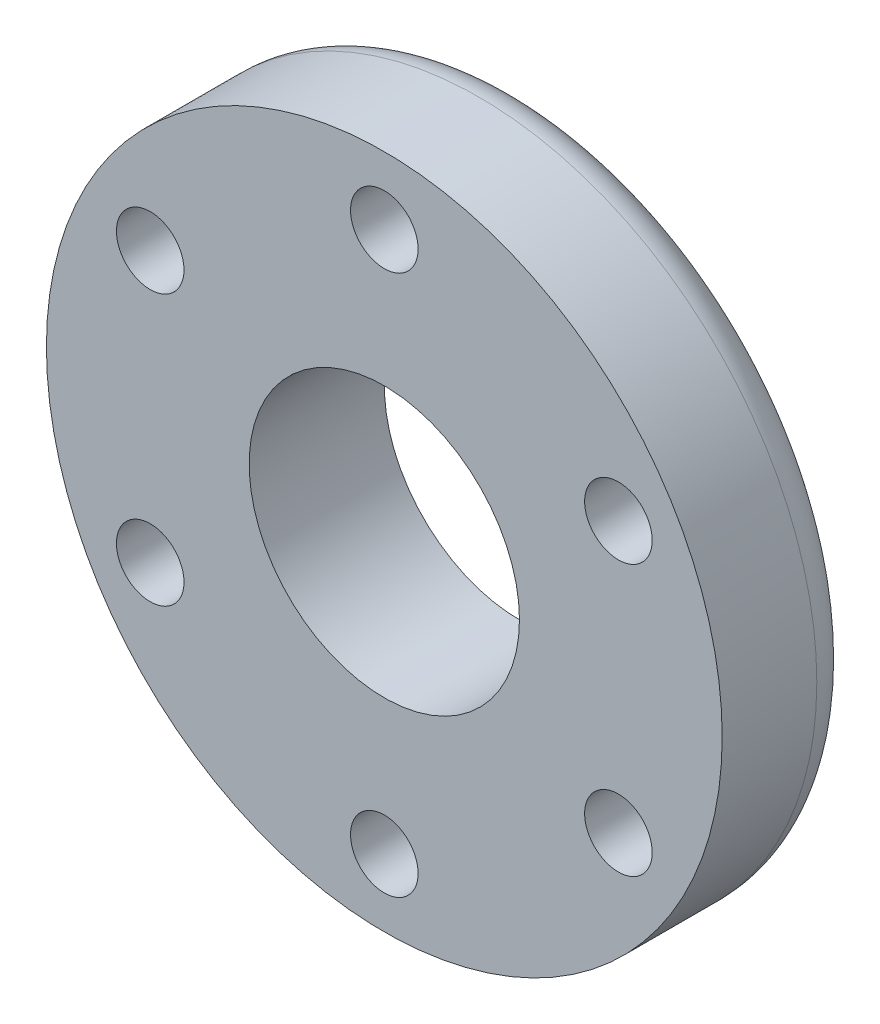
ISO-10303-21;
HEADER;
FILE_DESCRIPTION(('STEP AP214'),'2;1');
FILE_NAME('part.step','',(''),(''),'','','');
FILE_SCHEMA(('AUTOMOTIVE_DESIGN { 1 0 10303 214 1 1 1 1 }'));
ENDSEC;
DATA;
#1=APPLICATION_CONTEXT('core data for automotive mechanical design processes');
#2=APPLICATION_PROTOCOL_DEFINITION('international standard','automotive_design',2000,#1);
#3=PRODUCT_CONTEXT('',#1,'mechanical');
#4=PRODUCT('Part','Part','',(#3));
#5=PRODUCT_RELATED_PRODUCT_CATEGORY('part','',(#4));
#6=PRODUCT_DEFINITION_FORMATION('','',#4);
#7=PRODUCT_DEFINITION_CONTEXT('part definition',#1,'design');
#8=PRODUCT_DEFINITION('design','',#6,#7);
#9=PRODUCT_DEFINITION_SHAPE('','',#8);
#10=(LENGTH_UNIT() NAMED_UNIT(*) SI_UNIT(.MILLI.,.METRE.));
#11=(NAMED_UNIT(*) PLANE_ANGLE_UNIT() SI_UNIT($,.RADIAN.));
#12=(NAMED_UNIT(*) SI_UNIT($,.STERADIAN.) SOLID_ANGLE_UNIT());
#13=UNCERTAINTY_MEASURE_WITH_UNIT(LENGTH_MEASURE(1.E-05),#10,'distance_accuracy_value','');
#14=(GEOMETRIC_REPRESENTATION_CONTEXT(3) GLOBAL_UNCERTAINTY_ASSIGNED_CONTEXT((#13)) GLOBAL_UNIT_ASSIGNED_CONTEXT((#10,
#11,#12)) REPRESENTATION_CONTEXT('',''));
#15=CARTESIAN_POINT('',(0.,0.,0.));
#16=DIRECTION('',(0.,0.,1.));
#17=DIRECTION('',(1.,0.,0.));
#18=AXIS2_PLACEMENT_3D('',#15,#16,#17);
#19=CARTESIAN_POINT('',(0.,0.,10.));
#20=DIRECTION('',(0.,0.,1.));
#21=DIRECTION('',(1.,0.,0.));
#22=AXIS2_PLACEMENT_3D('',#19,#20,#21);
#23=PLANE('',#22);
#24=CARTESIAN_POINT('',(0.,20.,10.));
#25=DIRECTION('',(0.,0.,1.));
#26=DIRECTION('',(1.,0.,0.));
#27=AXIS2_PLACEMENT_3D('',#24,#25,#26);
#28=CIRCLE('',#27,2.5);
#29=CARTESIAN_POINT('',(2.5,20.,10.));
#30=VERTEX_POINT('',#29);
#31=EDGE_CURVE('E105',#30,#30,#28,.T.);
#32=ORIENTED_EDGE('',*,*,#31,.F.);
#33=EDGE_LOOP('',(#32));
#34=FACE_BOUND('',#33,.T.);
#35=CARTESIAN_POINT('',(-17.3205080756885,9.99999999999955,10.));
#36=DIRECTION('',(0.,0.,1.));
#37=DIRECTION('',(1.,0.,0.));
#38=AXIS2_PLACEMENT_3D('',#35,#36,#37);
#39=CIRCLE('',#38,2.5);
#40=CARTESIAN_POINT('',(-14.8205080756885,9.99999999999955,10.));
#41=VERTEX_POINT('',#40);
#42=EDGE_CURVE('E233',#41,#41,#39,.T.);
#43=ORIENTED_EDGE('',*,*,#42,.F.);
#44=EDGE_LOOP('',(#43));
#45=FACE_BOUND('',#44,.T.);
#46=CARTESIAN_POINT('',(-17.320508075688,-10.0000000000004,10.));
#47=DIRECTION('',(0.,0.,1.));
#48=DIRECTION('',(1.,0.,0.));
#49=AXIS2_PLACEMENT_3D('',#46,#47,#48);
#50=CIRCLE('',#49,2.5);
#51=CARTESIAN_POINT('',(-14.820508075688,-10.0000000000004,10.));
#52=VERTEX_POINT('',#51);
#53=EDGE_CURVE('E217',#52,#52,#50,.T.);
#54=ORIENTED_EDGE('',*,*,#53,.F.);
#55=EDGE_LOOP('',(#54));
#56=FACE_BOUND('',#55,.T.);
#57=CARTESIAN_POINT('',(1.01901774037744E-12,-20.,10.));
#58=DIRECTION('',(0.,0.,1.));
#59=DIRECTION('',(1.,0.,0.));
#60=AXIS2_PLACEMENT_3D('',#57,#58,#59);
#61=CIRCLE('',#60,2.5);
#62=CARTESIAN_POINT('',(2.50000000000102,-20.,10.));
#63=VERTEX_POINT('',#62);
#64=EDGE_CURVE('E209',#63,#63,#61,.T.);
#65=ORIENTED_EDGE('',*,*,#64,.F.);
#66=EDGE_LOOP('',(#65));
#67=FACE_BOUND('',#66,.T.);
#68=CARTESIAN_POINT('',(17.3205080756895,-9.99999999999956,10.));
#69=DIRECTION('',(0.,0.,1.));
#70=DIRECTION('',(1.,0.,0.));
#71=AXIS2_PLACEMENT_3D('',#68,#69,#70);
#72=CIRCLE('',#71,2.5);
#73=CARTESIAN_POINT('',(19.8205080756895,-9.99999999999956,10.));
#74=VERTEX_POINT('',#73);
#75=EDGE_CURVE('E208',#74,#74,#72,.T.);
#76=ORIENTED_EDGE('',*,*,#75,.F.);
#77=EDGE_LOOP('',(#76));
#78=FACE_BOUND('',#77,.T.);
#79=CARTESIAN_POINT('',(17.320508075689,10.0000000000004,10.));
#80=DIRECTION('',(0.,0.,1.));
#81=DIRECTION('',(1.,0.,0.));
#82=AXIS2_PLACEMENT_3D('',#79,#80,#81);
#83=CIRCLE('',#82,2.5);
#84=CARTESIAN_POINT('',(19.820508075689,10.0000000000004,10.));
#85=VERTEX_POINT('',#84);
#86=EDGE_CURVE('E228',#85,#85,#83,.T.);
#87=ORIENTED_EDGE('',*,*,#86,.F.);
#88=EDGE_LOOP('',(#87));
#89=FACE_BOUND('',#88,.T.);
#90=CARTESIAN_POINT('',(0.,0.,10.));
#91=DIRECTION('',(0.,0.,1.));
#92=DIRECTION('',(1.,0.,0.));
#93=AXIS2_PLACEMENT_3D('',#90,#91,#92);
#94=CIRCLE('',#93,25.);
#95=CARTESIAN_POINT('',(25.,0.,10.));
#96=VERTEX_POINT('',#95);
#97=EDGE_CURVE('E184',#96,#96,#94,.T.);
#98=ORIENTED_EDGE('',*,*,#97,.T.);
#99=EDGE_LOOP('',(#98));
#100=FACE_BOUND('',#99,.T.);
#101=CARTESIAN_POINT('',(0.,0.,10.));
#102=DIRECTION('',(0.,0.,1.));
#103=DIRECTION('',(1.,0.,0.));
#104=AXIS2_PLACEMENT_3D('',#101,#102,#103);
#105=CIRCLE('',#104,10.);
#106=CARTESIAN_POINT('',(10.,0.,10.));
#107=VERTEX_POINT('',#106);
#108=EDGE_CURVE('E186',#107,#107,#105,.T.);
#109=ORIENTED_EDGE('',*,*,#108,.F.);
#110=EDGE_LOOP('',(#109));
#111=FACE_BOUND('',#110,.T.);
#112=ADVANCED_FACE('F34',(#34,#45,#56,#67,#78,#89,#100,#111),#23,.T.);
#113=CARTESIAN_POINT('',(0.,0.,0.));
#114=DIRECTION('',(0.,0.,1.));
#115=DIRECTION('',(1.,0.,0.));
#116=AXIS2_PLACEMENT_3D('',#113,#114,#115);
#117=PLANE('',#116);
#118=CARTESIAN_POINT('',(-17.3205080756885,9.99999999999955,0.));
#119=DIRECTION('',(0.,0.,1.));
#120=DIRECTION('',(1.,0.,0.));
#121=AXIS2_PLACEMENT_3D('',#118,#119,#120);
#122=CIRCLE('',#121,2.5);
#123=CARTESIAN_POINT('',(-19.7899486270853,9.61030349871031,0.));
#124=VERTEX_POINT('',#123);
#125=CARTESIAN_POINT('',(-18.2177412815046,12.3334465012892,0.));
#126=VERTEX_POINT('',#125);
#127=EDGE_CURVE('E222',#124,#126,#122,.T.);
#128=ORIENTED_EDGE('',*,*,#127,.T.);
#129=CARTESIAN_POINT('',(0.,0.,0.));
#130=DIRECTION('',(0.,0.,1.));
#131=DIRECTION('',(1.,0.,0.));
#132=AXIS2_PLACEMENT_3D('',#129,#130,#131);
#133=CIRCLE('',#132,22.);
#134=CARTESIAN_POINT('',(-1.57220734558136,21.94375,0.));
#135=VERTEX_POINT('',#134);
#136=EDGE_CURVE('E99',#126,#135,#133,.F.);
#137=ORIENTED_EDGE('',*,*,#136,.T.);
#138=CARTESIAN_POINT('',(0.,20.,0.));
#139=DIRECTION('',(0.,0.,1.));
#140=DIRECTION('',(1.,0.,0.));
#141=AXIS2_PLACEMENT_3D('',#138,#139,#140);
#142=CIRCLE('',#141,2.5);
#143=CARTESIAN_POINT('',(1.57220734558136,21.94375,0.));
#144=VERTEX_POINT('',#143);
#145=EDGE_CURVE('E95',#135,#144,#142,.T.);
#146=ORIENTED_EDGE('',*,*,#145,.T.);
#147=CARTESIAN_POINT('',(0.,0.,0.));
#148=DIRECTION('',(0.,0.,1.));
#149=DIRECTION('',(1.,0.,0.));
#150=AXIS2_PLACEMENT_3D('',#147,#148,#149);
#151=CIRCLE('',#150,22.);
#152=CARTESIAN_POINT('',(18.2177412815036,12.3334465012907,0.));
#153=VERTEX_POINT('',#152);
#154=EDGE_CURVE('E61',#144,#153,#151,.F.);
#155=ORIENTED_EDGE('',*,*,#154,.T.);
#156=CARTESIAN_POINT('',(17.320508075689,10.0000000000004,0.));
#157=DIRECTION('',(0.,0.,1.));
#158=DIRECTION('',(1.,0.,0.));
#159=AXIS2_PLACEMENT_3D('',#156,#157,#158);
#160=CIRCLE('',#159,2.5);
#161=CARTESIAN_POINT('',(19.7899486270856,9.61030349870976,0.));
#162=VERTEX_POINT('',#161);
#163=EDGE_CURVE('E231',#153,#162,#160,.T.);
#164=ORIENTED_EDGE('',*,*,#163,.T.);
#165=CARTESIAN_POINT('',(0.,0.,0.));
#166=DIRECTION('',(0.,0.,1.));
#167=DIRECTION('',(1.,0.,0.));
#168=AXIS2_PLACEMENT_3D('',#165,#166,#167);
#169=CIRCLE('',#168,22.);
#170=CARTESIAN_POINT('',(19.7899486270861,-9.61030349870874,0.));
#171=VERTEX_POINT('',#170);
#172=EDGE_CURVE('E109',#162,#171,#169,.F.);
#173=ORIENTED_EDGE('',*,*,#172,.T.);
#174=CARTESIAN_POINT('',(17.3205080756895,-9.99999999999956,0.));
#175=DIRECTION('',(0.,0.,1.));
#176=DIRECTION('',(1.,0.,0.));
#177=AXIS2_PLACEMENT_3D('',#174,#175,#176);
#178=CIRCLE('',#177,2.5);
#179=CARTESIAN_POINT('',(18.2177412815042,-12.3334465012898,0.));
#180=VERTEX_POINT('',#179);
#181=EDGE_CURVE('E203',#171,#180,#178,.T.);
#182=ORIENTED_EDGE('',*,*,#181,.T.);
#183=CARTESIAN_POINT('',(0.,0.,0.));
#184=DIRECTION('',(0.,0.,1.));
#185=DIRECTION('',(1.,0.,0.));
#186=AXIS2_PLACEMENT_3D('',#183,#184,#185);
#187=CIRCLE('',#186,22.);
#188=CARTESIAN_POINT('',(1.57220734558248,-21.9437499999999,0.));
#189=VERTEX_POINT('',#188);
#190=EDGE_CURVE('E112',#180,#189,#187,.F.);
#191=ORIENTED_EDGE('',*,*,#190,.T.);
#192=CARTESIAN_POINT('',(1.01901774037744E-12,-20.,0.));
#193=DIRECTION('',(0.,0.,1.));
#194=DIRECTION('',(1.,0.,0.));
#195=AXIS2_PLACEMENT_3D('',#192,#193,#194);
#196=CIRCLE('',#195,2.5);
#197=CARTESIAN_POINT('',(-1.57220734558025,-21.9437500000001,0.));
#198=VERTEX_POINT('',#197);
#199=EDGE_CURVE('E200',#189,#198,#196,.T.);
#200=ORIENTED_EDGE('',*,*,#199,.T.);
#201=CARTESIAN_POINT('',(0.,0.,0.));
#202=DIRECTION('',(0.,0.,1.));
#203=DIRECTION('',(1.,0.,0.));
#204=AXIS2_PLACEMENT_3D('',#201,#202,#203);
#205=CIRCLE('',#204,22.);
#206=CARTESIAN_POINT('',(-18.217741281504,-12.3334465012902,0.));
#207=VERTEX_POINT('',#206);
#208=EDGE_CURVE('E195',#198,#207,#205,.F.);
#209=ORIENTED_EDGE('',*,*,#208,.T.);
#210=CARTESIAN_POINT('',(-17.320508075688,-10.0000000000004,0.));
#211=DIRECTION('',(0.,0.,1.));
#212=DIRECTION('',(1.,0.,0.));
#213=AXIS2_PLACEMENT_3D('',#210,#211,#212);
#214=CIRCLE('',#213,2.5);
#215=CARTESIAN_POINT('',(-19.7899486270848,-9.61030349871134,0.));
#216=VERTEX_POINT('',#215);
#217=EDGE_CURVE('E215',#207,#216,#214,.T.);
#218=ORIENTED_EDGE('',*,*,#217,.T.);
#219=CARTESIAN_POINT('',(0.,0.,0.));
#220=DIRECTION('',(0.,0.,1.));
#221=DIRECTION('',(1.,0.,0.));
#222=AXIS2_PLACEMENT_3D('',#219,#220,#221);
#223=CIRCLE('',#222,22.);
#224=EDGE_CURVE('E188',#216,#124,#223,.F.);
#225=ORIENTED_EDGE('',*,*,#224,.T.);
#226=EDGE_LOOP('',(#128,#137,#146,#155,#164,#173,#182,#191,#200,#209,#218,#225));
#227=FACE_BOUND('',#226,.T.);
#228=CARTESIAN_POINT('',(0.,0.,0.));
#229=DIRECTION('',(0.,0.,1.));
#230=DIRECTION('',(1.,0.,0.));
#231=AXIS2_PLACEMENT_3D('',#228,#229,#230);
#232=CIRCLE('',#231,10.);
#233=CARTESIAN_POINT('',(10.,0.,0.));
#234=VERTEX_POINT('',#233);
#235=EDGE_CURVE('E104',#234,#234,#232,.T.);
#236=ORIENTED_EDGE('',*,*,#235,.T.);
#237=EDGE_LOOP('',(#236));
#238=FACE_BOUND('',#237,.T.);
#239=ADVANCED_FACE('F102',(#227,#238),#117,.F.);
#240=CARTESIAN_POINT('',(0.,0.,10.));
#241=DIRECTION('',(0.,0.,-1.));
#242=DIRECTION('',(-1.,0.,0.));
#243=AXIS2_PLACEMENT_3D('',#240,#241,#242);
#244=CYLINDRICAL_SURFACE('',#243,25.);
#245=CARTESIAN_POINT('',(0.,0.,3.));
#246=DIRECTION('',(0.,0.,1.));
#247=DIRECTION('',(1.,0.,0.));
#248=AXIS2_PLACEMENT_3D('',#245,#246,#247);
#249=CIRCLE('',#248,25.);
#250=CARTESIAN_POINT('',(25.,0.,3.));
#251=VERTEX_POINT('',#250);
#252=EDGE_CURVE('E181',#251,#251,#249,.T.);
#253=ORIENTED_EDGE('',*,*,#252,.T.);
#254=EDGE_LOOP('',(#253));
#255=FACE_BOUND('',#254,.T.);
#256=ORIENTED_EDGE('',*,*,#97,.F.);
#257=EDGE_LOOP('',(#256));
#258=FACE_BOUND('',#257,.T.);
#259=ADVANCED_FACE('F168',(#255,#258),#244,.T.);
#260=CARTESIAN_POINT('',(0.,0.,10.));
#261=DIRECTION('',(0.,0.,-1.));
#262=DIRECTION('',(-1.,0.,0.));
#263=AXIS2_PLACEMENT_3D('',#260,#261,#262);
#264=CYLINDRICAL_SURFACE('',#263,10.);
#265=ORIENTED_EDGE('',*,*,#108,.T.);
#266=EDGE_LOOP('',(#265));
#267=FACE_BOUND('',#266,.T.);
#268=ORIENTED_EDGE('',*,*,#235,.F.);
#269=EDGE_LOOP('',(#268));
#270=FACE_BOUND('',#269,.T.);
#271=ADVANCED_FACE('F139',(#267,#270),#264,.F.);
#272=CARTESIAN_POINT('',(17.320508075689,10.0000000000004,0.));
#273=DIRECTION('',(0.,0.,1.));
#274=DIRECTION('',(1.,0.,0.));
#275=AXIS2_PLACEMENT_3D('',#272,#273,#274);
#276=CYLINDRICAL_SURFACE('',#275,2.5);
#277=ORIENTED_EDGE('',*,*,#163,.F.);
#278=CARTESIAN_POINT('',(18.2177412815036,12.3334465012907,0.));
#279=CARTESIAN_POINT('',(18.2832056373716,12.3082821339051,6.82539198225285E-06));
#280=CARTESIAN_POINT('',(18.3475942058358,12.2803549044649,0.000804197908983351));
#281=CARTESIAN_POINT('',(18.4737701723017,12.219209698216,0.00349742218280173));
#282=CARTESIAN_POINT('',(18.5355580823594,12.1859927691407,0.00539305660205358));
#283=CARTESIAN_POINT('',(18.6561116273502,12.1144916716412,0.00980065609428789));
#284=CARTESIAN_POINT('',(18.7148771496654,12.076207314588,0.012312644113273));
#285=CARTESIAN_POINT('',(18.828969637616,11.9948581847215,0.0175340205359171));
#286=CARTESIAN_POINT('',(18.884296501578,11.9517932706627,0.0202434147712945));
#287=CARTESIAN_POINT('',(19.0445509659921,11.8158352807627,0.028094349332947));
#288=CARTESIAN_POINT('',(19.1438485680096,11.7161218248486,0.0329633440299623));
#289=CARTESIAN_POINT('',(19.3242656068023,11.501535817026,0.039812908331603));
#290=CARTESIAN_POINT('',(19.4053989059641,11.386674932244,0.0417956870017009));
#291=CARTESIAN_POINT('',(19.5471212031826,11.1453072470127,0.0421039536727059));
#292=CARTESIAN_POINT('',(19.6077629896703,11.0188314547715,0.0404389230365805));
#293=CARTESIAN_POINT('',(19.7071044374008,10.7574326682541,0.0341129941163391));
#294=CARTESIAN_POINT('',(19.7457861840406,10.6225028766983,0.029449656461579));
#295=CARTESIAN_POINT('',(19.7871617617176,10.4135369366682,0.0216028505850631));
#296=CARTESIAN_POINT('',(19.7982220269587,10.3410422075517,0.0187695904180207));
#297=CARTESIAN_POINT('',(19.8139408395228,10.1953348395512,0.0132587744026272));
#298=CARTESIAN_POINT('',(19.8185992630457,10.1221221868114,0.0105812215663325));
#299=CARTESIAN_POINT('',(19.8214633388632,9.97552301658082,0.00585328061624235));
#300=CARTESIAN_POINT('',(19.8196663811851,9.90213644075737,0.00380314653749144));
#301=CARTESIAN_POINT('',(19.809633269346,9.75577039093348,0.000880557411905546));
#302=CARTESIAN_POINT('',(19.8013960221186,9.68279098815754,8.30234698967609E-06));
#303=CARTESIAN_POINT('',(19.7899486270856,9.61030349870976,0.));
#304=B_SPLINE_CURVE_WITH_KNOTS('',3,(#278,#279,#280,#281,#282,#283,#284,#285,#286,#287,#288,
#289,#290,#291,#292,#293,#294,#295,#296,#297,#298,#299,#300,#301,#302,#303),.UNSPECIFIED.,.F.,
.F.,(4,2,2,2,2,2,2,2,2,2,2,2,4),(0.,0.210317457748409,0.420593309502231,0.63087699072689,
0.84116688661319,1.26141509935925,1.68134149113573,2.10017770808424,2.51935511485407,
2.73928402079834,2.95921717970921,3.17923926971535,3.39929871067989),.UNSPECIFIED.);
#305=EDGE_CURVE('E54',#153,#162,#304,.T.);
#306=ORIENTED_EDGE('',*,*,#305,.T.);
#307=EDGE_LOOP('',(#277,#306));
#308=FACE_BOUND('',#307,.T.);
#309=ORIENTED_EDGE('',*,*,#86,.T.);
#310=EDGE_LOOP('',(#309));
#311=FACE_BOUND('',#310,.T.);
#312=ADVANCED_FACE('F134',(#308,#311),#276,.F.);
#313=CARTESIAN_POINT('',(17.3205080756895,-9.99999999999956,0.));
#314=DIRECTION('',(0.,0.,1.));
#315=DIRECTION('',(1.,0.,0.));
#316=AXIS2_PLACEMENT_3D('',#313,#314,#315);
#317=CYLINDRICAL_SURFACE('',#316,2.5);
#318=ORIENTED_EDGE('',*,*,#181,.F.);
#319=CARTESIAN_POINT('',(19.7899486270861,-9.61030349870874,0.));
#320=CARTESIAN_POINT('',(19.8008878235939,-9.67957947762561,6.82539198189633E-06));
#321=CARTESIAN_POINT('',(19.8088964176736,-9.74930522834903,0.000804197908983175));
#322=CARTESIAN_POINT('',(19.8190310989753,-9.88914942378001,0.00349742218280199));
#323=CARTESIAN_POINT('',(19.8211583495893,-9.9592677880743,0.00539305660205408));
#324=CARTESIAN_POINT('',(19.8195133552517,-10.0994207693024,0.00980065609428801));
#325=CARTESIAN_POINT('',(19.8157408906336,-10.1694553830206,0.0123126441132725));
#326=CARTESIAN_POINT('',(19.8023367215687,-10.3089369409001,0.0175340205359162));
#327=CARTESIAN_POINT('',(19.792704843963,-10.3783838676323,0.0202434147712939));
#328=CARTESIAN_POINT('',(19.7550890030693,-10.5851472998347,0.0280943493329469));
#329=CARTESIAN_POINT('',(19.7183834181572,-10.7209982736739,0.0329633440299624));
#330=CARTESIAN_POINT('',(19.6227550034825,-10.9845370164552,0.0398129083316029));
#331=CARTESIAN_POINT('',(19.563849208941,-11.1122309570131,0.0417956870017007));
#332=CARTESIAN_POINT('',(19.4256798104874,-11.3556499093027,0.0421039536727057));
#333=CARTESIAN_POINT('',(19.3464694546866,-11.4714051330526,0.0404389230365805));
#334=CARTESIAN_POINT('',(19.1697621889094,-11.6881367436945,0.0341129941163392));
#335=CARTESIAN_POINT('',(19.0722504350146,-11.7891010147253,0.0294496564615791));
#336=CARTESIAN_POINT('',(18.9119684112613,-11.9294162861049,0.0216028505850633));
#337=CARTESIAN_POINT('',(18.8547162668265,-11.9752421213345,0.018769590418021));
#338=CARTESIAN_POINT('',(18.7363893909016,-12.0617086963326,0.0132587744026275));
#339=CARTESIAN_POINT('',(18.675314585512,-12.102349335815,0.0105812215663328));
#340=CARTESIAN_POINT('',(18.5497880178273,-12.1781292833466,0.00585328061624242));
#341=CARTESIAN_POINT('',(18.4853349000284,-12.2132663602595,0.00380314653749114));
#342=CARTESIAN_POINT('',(18.3535616267098,-12.2777604554398,0.000880557411904904));
#343=CARTESIAN_POINT('',(18.2862409863391,-12.3071164914716,8.3023469890723E-06));
#344=CARTESIAN_POINT('',(18.2177412815042,-12.3334465012898,0.));
#345=B_SPLINE_CURVE_WITH_KNOTS('',3,(#319,#320,#321,#322,#323,#324,#325,#326,#327,#328,#329,
#330,#331,#332,#333,#334,#335,#336,#337,#338,#339,#340,#341,#342,#343,#344),.UNSPECIFIED.,.F.,
.F.,(4,2,2,2,2,2,2,2,2,2,2,2,4),(0.,0.210317457748411,0.420593309502231,0.630876990726893,
0.84116688661319,1.26141509935925,1.68134149113573,2.10017770808424,2.51935511485407,
2.73928402079834,2.95921717970922,3.17923926971537,3.39929871067991),.UNSPECIFIED.);
#346=EDGE_CURVE('E147',#171,#180,#345,.T.);
#347=ORIENTED_EDGE('',*,*,#346,.T.);
#348=EDGE_LOOP('',(#318,#347));
#349=FACE_BOUND('',#348,.T.);
#350=ORIENTED_EDGE('',*,*,#75,.T.);
#351=EDGE_LOOP('',(#350));
#352=FACE_BOUND('',#351,.T.);
#353=ADVANCED_FACE('F138',(#349,#352),#317,.F.);
#354=CARTESIAN_POINT('',(1.01901774037744E-12,-20.,0.));
#355=DIRECTION('',(0.,0.,1.));
#356=DIRECTION('',(1.,0.,0.));
#357=AXIS2_PLACEMENT_3D('',#354,#355,#356);
#358=CYLINDRICAL_SURFACE('',#357,2.5);
#359=ORIENTED_EDGE('',*,*,#199,.F.);
#360=CARTESIAN_POINT('',(1.57220734558248,-21.9437499999999,0.));
#361=CARTESIAN_POINT('',(1.51768218622235,-21.9878616115311,6.82539198234342E-06));
#362=CARTESIAN_POINT('',(1.46130221183774,-22.0296601328144,0.000804197908982905));
#363=CARTESIAN_POINT('',(1.34526092667355,-22.1083591219964,0.00349742218279888));
#364=CARTESIAN_POINT('',(1.28560026722987,-22.1452605572155,0.00539305660204884));
#365=CARTESIAN_POINT('',(1.1634017279014,-22.213912440944,0.00980065609427802));
#366=CARTESIAN_POINT('',(1.10086374096809,-22.245662697609,0.0123126441132599));
#367=CARTESIAN_POINT('',(0.973367083952614,-22.3037951256219,0.0175340205358979));
#368=CARTESIAN_POINT('',(0.908408342384923,-22.3301771382953,0.0202434147712724));
#369=CARTESIAN_POINT('',(0.710538037077045,-22.4009825805977,0.0280943493329147));
#370=CARTESIAN_POINT('',(0.574534850147465,-22.4371200985226,0.032963344029921));
#371=CARTESIAN_POINT('',(0.29848939668007,-22.4860728334813,0.0398129083315443));
#372=CARTESIAN_POINT('',(0.158450302976777,-22.4989058892572,0.0417956870016339));
#373=CARTESIAN_POINT('',(-0.121441392695359,-22.5009571563154,0.0421039536726255));
#374=CARTESIAN_POINT('',(-0.261293534983933,-22.4902365878241,0.0404389230364951));
#375=CARTESIAN_POINT('',(-0.537342248491586,-22.4455694119486,0.0341129941162491));
#376=CARTESIAN_POINT('',(-0.673535749026206,-22.4116038914235,0.0294496564614895));
#377=CARTESIAN_POINT('',(-0.87519335045632,-22.3429532227729,0.0216028505849852));
#378=CARTESIAN_POINT('',(-0.943505760132109,-22.3162843288861,0.0187695904179516));
#379=CARTESIAN_POINT('',(-1.07755144862091,-22.2570435358838,0.0132587744025761));
#380=CARTESIAN_POINT('',(-1.14328467753336,-22.2244715226264,0.0105812215662907));
#381=CARTESIAN_POINT('',(-1.2716753210353,-22.1536522999275,0.00585328061621814));
#382=CARTESIAN_POINT('',(-1.334331481156,-22.1154028010171,0.00380314653747539));
#383=CARTESIAN_POINT('',(-1.45607164263533,-22.0335308463737,0.000880557411901457));
#384=CARTESIAN_POINT('',(-1.51515503577851,-21.9899074796296,8.30234698938286E-06));
#385=CARTESIAN_POINT('',(-1.57220734558025,-21.9437500000001,0.));
#386=B_SPLINE_CURVE_WITH_KNOTS('',3,(#360,#361,#362,#363,#364,#365,#366,#367,#368,#369,#370,
#371,#372,#373,#374,#375,#376,#377,#378,#379,#380,#381,#382,#383,#384,#385),.UNSPECIFIED.,.F.,
.F.,(4,2,2,2,2,2,2,2,2,2,2,2,4),(0.,0.210317457748412,0.420593309502235,0.630876990726898,
0.841166886613196,1.26141509935926,1.68134149113575,2.10017770808425,2.51935511485409,
2.73928402079796,2.95921717970845,3.17923926971421,3.39929871067836),.UNSPECIFIED.);
#387=EDGE_CURVE('E153',#189,#198,#386,.T.);
#388=ORIENTED_EDGE('',*,*,#387,.T.);
#389=EDGE_LOOP('',(#359,#388));
#390=FACE_BOUND('',#389,.T.);
#391=ORIENTED_EDGE('',*,*,#64,.T.);
#392=EDGE_LOOP('',(#391));
#393=FACE_BOUND('',#392,.T.);
#394=ADVANCED_FACE('F143',(#390,#393),#358,.F.);
#395=CARTESIAN_POINT('',(-17.320508075688,-10.0000000000004,0.));
#396=DIRECTION('',(0.,0.,1.));
#397=DIRECTION('',(1.,0.,0.));
#398=AXIS2_PLACEMENT_3D('',#395,#396,#397);
#399=CYLINDRICAL_SURFACE('',#398,2.5);
#400=ORIENTED_EDGE('',*,*,#217,.F.);
#401=CARTESIAN_POINT('',(-18.217741281504,-12.3334465012902,0.));
#402=CARTESIAN_POINT('',(-18.2832056373719,-12.3082821339045,6.82539198237108E-06));
#403=CARTESIAN_POINT('',(-18.3475942058361,-12.2803549044643,0.00080419790898225));
#404=CARTESIAN_POINT('',(-18.473770172302,-12.2192096982153,0.0034974221827958));
#405=CARTESIAN_POINT('',(-18.5355580823596,-12.18599276914,0.00539305660204404));
#406=CARTESIAN_POINT('',(-18.6561116273504,-12.1144916716405,0.00980065609426902));
#407=CARTESIAN_POINT('',(-18.7148771496656,-12.0762073145871,0.0123126441132484));
#408=CARTESIAN_POINT('',(-18.8289696376162,-11.9948581847206,0.01753402053588));
#409=CARTESIAN_POINT('',(-18.8842965015781,-11.9517932706618,0.0202434147712506));
#410=CARTESIAN_POINT('',(-19.0445509659921,-11.8158352807617,0.0280943493328809));
#411=CARTESIAN_POINT('',(-19.1438485680096,-11.7161218248475,0.032963344029879));
#412=CARTESIAN_POINT('',(-19.3242656068021,-11.5015358170248,0.0398129083314858));
#413=CARTESIAN_POINT('',(-19.4053989059639,-11.3866749322427,0.041795687001567));
#414=CARTESIAN_POINT('',(-19.5471212031822,-11.1453072470114,0.0421039536725454));
#415=CARTESIAN_POINT('',(-19.6077629896699,-11.0188314547701,0.04043892303641));
#416=CARTESIAN_POINT('',(-19.7071044374002,-10.7574326682527,0.0341129941161597));
#417=CARTESIAN_POINT('',(-19.74578618404,-10.6225028766969,0.0294496564614006));
#418=CARTESIAN_POINT('',(-19.7871617617168,-10.413536936667,0.0216028505849074));
#419=CARTESIAN_POINT('',(-19.7982220269578,-10.3410422075507,0.0187695904178821));
#420=CARTESIAN_POINT('',(-19.8139408395218,-10.1953348395507,0.0132587744025246));
#421=CARTESIAN_POINT('',(-19.8185992630447,-10.1221221868112,0.010581221566249));
#422=CARTESIAN_POINT('',(-19.8214633388622,-9.97552301658112,0.0058532806161942));
#423=CARTESIAN_POINT('',(-19.8196663811841,-9.90213644075794,0.00380314653745955));
#424=CARTESIAN_POINT('',(-19.8096332693451,-9.75577039093456,0.000880557411897551));
#425=CARTESIAN_POINT('',(-19.8013960221178,-9.68279098815887,8.30234698931315E-06));
#426=CARTESIAN_POINT('',(-19.7899486270848,-9.61030349871134,0.));
#427=B_SPLINE_CURVE_WITH_KNOTS('',3,(#401,#402,#403,#404,#405,#406,#407,#408,#409,#410,#411,
#412,#413,#414,#415,#416,#417,#418,#419,#420,#421,#422,#423,#424,#425,#426),.UNSPECIFIED.,.F.,
.F.,(4,2,2,2,2,2,2,2,2,2,2,2,4),(0.,0.21031745774841,0.420593309502235,0.6308769907269,
0.841166886613199,1.26141509935927,1.68134149113576,2.10017770808426,2.51935511485409,
2.73928402079759,2.95921717970769,3.17923926971306,3.39929871067682),.UNSPECIFIED.);
#428=EDGE_CURVE('E48',#207,#216,#427,.T.);
#429=ORIENTED_EDGE('',*,*,#428,.T.);
#430=EDGE_LOOP('',(#400,#429));
#431=FACE_BOUND('',#430,.T.);
#432=ORIENTED_EDGE('',*,*,#53,.T.);
#433=EDGE_LOOP('',(#432));
#434=FACE_BOUND('',#433,.T.);
#435=ADVANCED_FACE('F132',(#431,#434),#399,.F.);
#436=CARTESIAN_POINT('',(-17.3205080756885,9.99999999999955,0.));
#437=DIRECTION('',(0.,0.,1.));
#438=DIRECTION('',(1.,0.,0.));
#439=AXIS2_PLACEMENT_3D('',#436,#437,#438);
#440=CYLINDRICAL_SURFACE('',#439,2.5);
#441=ORIENTED_EDGE('',*,*,#127,.F.);
#442=CARTESIAN_POINT('',(-19.7899486270853,9.61030349871031,0.));
#443=CARTESIAN_POINT('',(-19.8008878235931,9.67957947762719,6.82539198193775E-06));
#444=CARTESIAN_POINT('',(-19.8088964176727,9.74930522835061,0.000804197908981819));
#445=CARTESIAN_POINT('',(-19.8190310989744,9.8891494237816,0.00349742218279561));
#446=CARTESIAN_POINT('',(-19.8211583495883,9.9592677880759,0.00539305660204409));
#447=CARTESIAN_POINT('',(-19.8195133552506,10.099420769304,0.00980065609426912));
#448=CARTESIAN_POINT('',(-19.8157408906325,10.1694553830222,0.0123126441132483));
#449=CARTESIAN_POINT('',(-19.8023367215675,10.3089369409017,0.0175340205358797));
#450=CARTESIAN_POINT('',(-19.7927048439618,10.3783838676339,0.0202434147712504));
#451=CARTESIAN_POINT('',(-19.7550890030679,10.5851472998363,0.0280943493328808));
#452=CARTESIAN_POINT('',(-19.7183834181557,10.7209982736754,0.0329633440298789));
#453=CARTESIAN_POINT('',(-19.6227550034809,10.9845370164567,0.0398129083314856));
#454=CARTESIAN_POINT('',(-19.5638492089393,11.1122309570146,0.0417956870015668));
#455=CARTESIAN_POINT('',(-19.4256798104855,11.355649909304,0.0421039536725453));
#456=CARTESIAN_POINT('',(-19.3464694546847,11.4714051330539,0.0404389230364101));
#457=CARTESIAN_POINT('',(-19.1697621889073,11.6881367436957,0.0341129941161597));
#458=CARTESIAN_POINT('',(-19.0722504350125,11.7891010147265,0.0294496564614004));
#459=CARTESIAN_POINT('',(-18.9119684112593,11.9294162861058,0.0216028505849072));
#460=CARTESIAN_POINT('',(-18.8547162668246,11.9752421213352,0.018769590417882));
#461=CARTESIAN_POINT('',(-18.7363893909,12.0617086963329,0.0132587744025246));
#462=CARTESIAN_POINT('',(-18.6753145855107,12.1023493358151,0.0105812215662488));
#463=CARTESIAN_POINT('',(-18.5497880178264,12.1781292833465,0.00585328061619404));
#464=CARTESIAN_POINT('',(-18.4853349000277,12.2132663602593,0.00380314653745944));
#465=CARTESIAN_POINT('',(-18.3535616267096,12.2777604554394,0.000880557411897493));
#466=CARTESIAN_POINT('',(-18.2862409863392,12.3071164914711,8.30234698924713E-06));
#467=CARTESIAN_POINT('',(-18.2177412815046,12.3334465012892,0.));
#468=B_SPLINE_CURVE_WITH_KNOTS('',3,(#442,#443,#444,#445,#446,#447,#448,#449,#450,#451,#452,
#453,#454,#455,#456,#457,#458,#459,#460,#461,#462,#463,#464,#465,#466,#467),.UNSPECIFIED.,.F.,
.F.,(4,2,2,2,2,2,2,2,2,2,2,2,4),(0.,0.210317457748413,0.420593309502239,0.630876990726899,
0.8411668866132,1.26141509935927,1.68134149113576,2.10017770808426,2.5193551148541,
2.73928402079759,2.95921717970769,3.17923926971306,3.39929871067683),.UNSPECIFIED.);
#469=EDGE_CURVE('E11',#124,#126,#468,.T.);
#470=ORIENTED_EDGE('',*,*,#469,.T.);
#471=EDGE_LOOP('',(#441,#470));
#472=FACE_BOUND('',#471,.T.);
#473=ORIENTED_EDGE('',*,*,#42,.T.);
#474=EDGE_LOOP('',(#473));
#475=FACE_BOUND('',#474,.T.);
#476=ADVANCED_FACE('F129',(#472,#475),#440,.F.);
#477=CARTESIAN_POINT('',(0.,20.,0.));
#478=DIRECTION('',(0.,0.,1.));
#479=DIRECTION('',(1.,0.,0.));
#480=AXIS2_PLACEMENT_3D('',#477,#478,#479);
#481=CYLINDRICAL_SURFACE('',#480,2.5);
#482=ORIENTED_EDGE('',*,*,#145,.F.);
#483=CARTESIAN_POINT('',(-1.57220734558136,21.94375,0.));
#484=CARTESIAN_POINT('',(-1.51768218622123,21.9878616115312,6.82539198222866E-06));
#485=CARTESIAN_POINT('',(-1.46130221183662,22.0296601328145,0.000804197908982788));
#486=CARTESIAN_POINT('',(-1.34526092667242,22.1083591219965,0.0034974221827989));
#487=CARTESIAN_POINT('',(-1.28560026722874,22.1452605572155,0.005393056602049));
#488=CARTESIAN_POINT('',(-1.16340172790027,22.213912440944,0.00980065609427854));
#489=CARTESIAN_POINT('',(-1.10086374096695,22.245662697609,0.0123126441132607));
#490=CARTESIAN_POINT('',(-0.973367083951477,22.3037951256219,0.0175340205358984));
#491=CARTESIAN_POINT('',(-0.908408342383786,22.3301771382953,0.0202434147712724));
#492=CARTESIAN_POINT('',(-0.710538037075905,22.4009825805978,0.0280943493329141));
#493=CARTESIAN_POINT('',(-0.574534850146322,22.4371200985227,0.032963344029921));
#494=CARTESIAN_POINT('',(-0.298489396678924,22.4860728334813,0.0398129083315445));
#495=CARTESIAN_POINT('',(-0.158450302975631,22.4989058892572,0.0417956870016338));
#496=CARTESIAN_POINT('',(0.121441392696505,22.5009571563154,0.0421039536726253));
#497=CARTESIAN_POINT('',(0.261293534985079,22.4902365878241,0.0404389230364951));
#498=CARTESIAN_POINT('',(0.53734224849273,22.4455694119486,0.0341129941162493));
#499=CARTESIAN_POINT('',(0.673535749027348,22.4116038914235,0.0294496564614897));
#500=CARTESIAN_POINT('',(0.875193350457458,22.3429532227729,0.0216028505849854));
#501=CARTESIAN_POINT('',(0.943505760133245,22.316284328886,0.0187695904179517));
#502=CARTESIAN_POINT('',(1.07755144862204,22.2570435358837,0.0132587744025761));
#503=CARTESIAN_POINT('',(1.14328467753449,22.2244715226263,0.0105812215662906));
#504=CARTESIAN_POINT('',(1.27167532103643,22.1536522999275,0.00585328061621802));
#505=CARTESIAN_POINT('',(1.33433148115712,22.1154028010171,0.00380314653747531));
#506=CARTESIAN_POINT('',(1.45607164263645,22.0335308463736,0.000880557411901504));
#507=CARTESIAN_POINT('',(1.51515503577963,21.9899074796295,8.30234698949487E-06));
#508=CARTESIAN_POINT('',(1.57220734558136,21.94375,0.));
#509=B_SPLINE_CURVE_WITH_KNOTS('',3,(#483,#484,#485,#486,#487,#488,#489,#490,#491,#492,#493,
#494,#495,#496,#497,#498,#499,#500,#501,#502,#503,#504,#505,#506,#507,#508),.UNSPECIFIED.,.F.,
.F.,(4,2,2,2,2,2,2,2,2,2,2,2,4),(0.,0.210317457748414,0.420593309502236,0.630876990726899,
0.841166886613195,1.26141509935926,1.68134149113575,2.10017770808425,2.51935511485409,
2.73928402079796,2.95921717970845,3.17923926971421,3.39929871067836),.UNSPECIFIED.);
#510=EDGE_CURVE('E92',#135,#144,#509,.T.);
#511=ORIENTED_EDGE('',*,*,#510,.T.);
#512=EDGE_LOOP('',(#482,#511));
#513=FACE_BOUND('',#512,.T.);
#514=ORIENTED_EDGE('',*,*,#31,.T.);
#515=EDGE_LOOP('',(#514));
#516=FACE_BOUND('',#515,.T.);
#517=ADVANCED_FACE('F93',(#513,#516),#481,.F.);
#518=CARTESIAN_POINT('',(0.,0.,3.));
#519=DIRECTION('',(0.,0.,1.));
#520=DIRECTION('',(1.,0.,0.));
#521=AXIS2_PLACEMENT_3D('',#518,#519,#520);
#522=TOROIDAL_SURFACE('',#521,22.,3.);
#523=ORIENTED_EDGE('',*,*,#510,.F.);
#524=ORIENTED_EDGE('',*,*,#136,.F.);
#525=ORIENTED_EDGE('',*,*,#469,.F.);
#526=ORIENTED_EDGE('',*,*,#224,.F.);
#527=ORIENTED_EDGE('',*,*,#428,.F.);
#528=ORIENTED_EDGE('',*,*,#208,.F.);
#529=ORIENTED_EDGE('',*,*,#387,.F.);
#530=ORIENTED_EDGE('',*,*,#190,.F.);
#531=ORIENTED_EDGE('',*,*,#346,.F.);
#532=ORIENTED_EDGE('',*,*,#172,.F.);
#533=ORIENTED_EDGE('',*,*,#305,.F.);
#534=ORIENTED_EDGE('',*,*,#154,.F.);
#535=EDGE_LOOP('',(#523,#524,#525,#526,#527,#528,#529,#530,#531,#532,#533,#534));
#536=FACE_BOUND('',#535,.T.);
#537=ORIENTED_EDGE('',*,*,#252,.F.);
#538=EDGE_LOOP('',(#537));
#539=FACE_BOUND('',#538,.T.);
#540=ADVANCED_FACE('F36',(#536,#539),#522,.T.);
#541=CLOSED_SHELL('',(#112,#239,#259,#271,#312,#353,#394,#435,#476,#517,#540));
#542=MANIFOLD_SOLID_BREP('B2',#541);
#543=ADVANCED_BREP_SHAPE_REPRESENTATION('',(#18,#542),#14);
#544=SHAPE_DEFINITION_REPRESENTATION(#9,#543);
ENDSEC;
END-ISO-10303-21;
